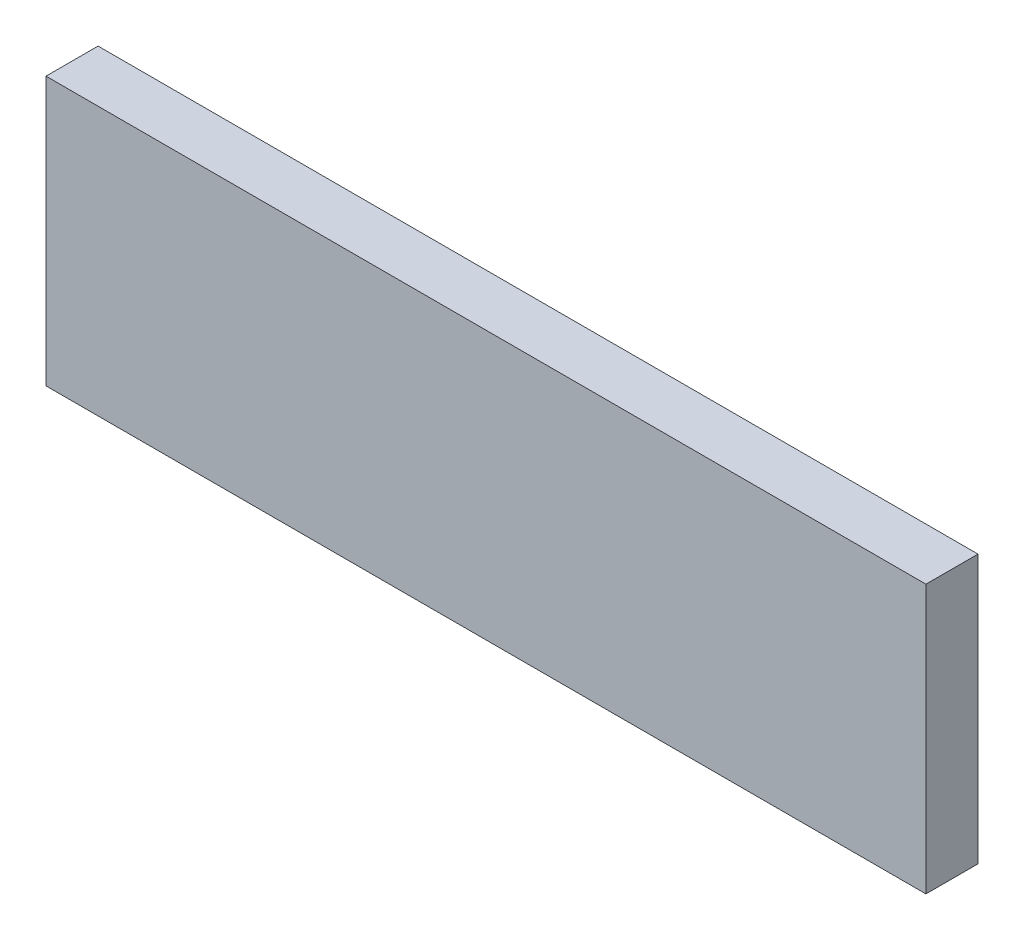
ISO-10303-21;
HEADER;
FILE_DESCRIPTION(('STEP AP214'),'2;1');
FILE_NAME('part.step','',(''),(''),'','','');
FILE_SCHEMA(('AUTOMOTIVE_DESIGN { 1 0 10303 214 1 1 1 1 }'));
ENDSEC;
DATA;
#1=APPLICATION_CONTEXT('core data for automotive mechanical design processes');
#2=APPLICATION_PROTOCOL_DEFINITION('international standard','automotive_design',2000,#1);
#3=PRODUCT_CONTEXT('',#1,'mechanical');
#4=PRODUCT('Part','Part','',(#3));
#5=PRODUCT_RELATED_PRODUCT_CATEGORY('part','',(#4));
#6=PRODUCT_DEFINITION_FORMATION('','',#4);
#7=PRODUCT_DEFINITION_CONTEXT('part definition',#1,'design');
#8=PRODUCT_DEFINITION('design','',#6,#7);
#9=PRODUCT_DEFINITION_SHAPE('','',#8);
#10=(LENGTH_UNIT() NAMED_UNIT(*) SI_UNIT(.MILLI.,.METRE.));
#11=(NAMED_UNIT(*) PLANE_ANGLE_UNIT() SI_UNIT($,.RADIAN.));
#12=(NAMED_UNIT(*) SI_UNIT($,.STERADIAN.) SOLID_ANGLE_UNIT());
#13=UNCERTAINTY_MEASURE_WITH_UNIT(LENGTH_MEASURE(1.E-05),#10,'distance_accuracy_value','');
#14=(GEOMETRIC_REPRESENTATION_CONTEXT(3) GLOBAL_UNCERTAINTY_ASSIGNED_CONTEXT((#13)) GLOBAL_UNIT_ASSIGNED_CONTEXT((#10,
#11,#12)) REPRESENTATION_CONTEXT('',''));
#15=CARTESIAN_POINT('',(0.,0.,0.));
#16=DIRECTION('',(0.,0.,1.));
#17=DIRECTION('',(1.,0.,0.));
#18=AXIS2_PLACEMENT_3D('',#15,#16,#17);
#19=CARTESIAN_POINT('',(22.3843412182742,-5.45939936918301,2.54));
#20=DIRECTION('',(-1.,0.,0.));
#21=DIRECTION('',(0.,0.,1.));
#22=AXIS2_PLACEMENT_3D('',#19,#20,#21);
#23=PLANE('',#22);
#24=DIRECTION('',(0.,1.,0.));
#25=VECTOR('',#24,1.);
#26=CARTESIAN_POINT('',(22.3843412182742,-5.45939936918301,0.));
#27=LINE('',#26,#25);
#28=CARTESIAN_POINT('',(22.3843412182742,-18.5448221959597,0.));
#29=VERTEX_POINT('',#28);
#30=CARTESIAN_POINT('',(22.3843412182742,-5.45939936918301,0.));
#31=VERTEX_POINT('',#30);
#32=EDGE_CURVE('E104',#29,#31,#27,.T.);
#33=ORIENTED_EDGE('',*,*,#32,.T.);
#34=DIRECTION('',(0.,0.,-1.));
#35=VECTOR('',#34,1.);
#36=CARTESIAN_POINT('',(22.3843412182742,-5.45939936918301,2.54));
#37=LINE('',#36,#35);
#38=CARTESIAN_POINT('',(22.3843412182742,-5.45939936918301,2.54));
#39=VERTEX_POINT('',#38);
#40=EDGE_CURVE('E11',#39,#31,#37,.T.);
#41=ORIENTED_EDGE('',*,*,#40,.F.);
#42=DIRECTION('',(0.,1.,0.));
#43=VECTOR('',#42,1.);
#44=CARTESIAN_POINT('',(22.3843412182742,-5.45939936918301,2.54));
#45=LINE('',#44,#43);
#46=CARTESIAN_POINT('',(22.3843412182742,-18.5448221959597,2.54));
#47=VERTEX_POINT('',#46);
#48=EDGE_CURVE('E92',#47,#39,#45,.T.);
#49=ORIENTED_EDGE('',*,*,#48,.F.);
#50=DIRECTION('',(0.,0.,-1.));
#51=VECTOR('',#50,1.);
#52=CARTESIAN_POINT('',(22.3843412182742,-18.5448221959597,2.54));
#53=LINE('',#52,#51);
#54=EDGE_CURVE('E100',#47,#29,#53,.T.);
#55=ORIENTED_EDGE('',*,*,#54,.T.);
#56=EDGE_LOOP('',(#33,#41,#49,#55));
#57=FACE_BOUND('',#56,.T.);
#58=ADVANCED_FACE('F41',(#57),#23,.F.);
#59=CARTESIAN_POINT('',(22.3843412182742,-5.45939936918301,2.54));
#60=DIRECTION('',(0.,-1.,0.));
#61=DIRECTION('',(0.,0.,-1.));
#62=AXIS2_PLACEMENT_3D('',#59,#60,#61);
#63=PLANE('',#62);
#64=DIRECTION('',(-1.,0.,0.));
#65=VECTOR('',#64,1.);
#66=CARTESIAN_POINT('',(22.3843412182742,-5.45939936918301,0.));
#67=LINE('',#66,#65);
#68=CARTESIAN_POINT('',(-20.5358456535535,-5.45939936918301,0.));
#69=VERTEX_POINT('',#68);
#70=EDGE_CURVE('E96',#31,#69,#67,.T.);
#71=ORIENTED_EDGE('',*,*,#70,.T.);
#72=DIRECTION('',(0.,0.,-1.));
#73=VECTOR('',#72,1.);
#74=CARTESIAN_POINT('',(-20.5358456535535,-5.45939936918301,2.54));
#75=LINE('',#74,#73);
#76=CARTESIAN_POINT('',(-20.5358456535535,-5.45939936918301,2.54));
#77=VERTEX_POINT('',#76);
#78=EDGE_CURVE('E49',#77,#69,#75,.T.);
#79=ORIENTED_EDGE('',*,*,#78,.F.);
#80=DIRECTION('',(-1.,0.,0.));
#81=VECTOR('',#80,1.);
#82=CARTESIAN_POINT('',(22.3843412182742,-5.45939936918301,2.54));
#83=LINE('',#82,#81);
#84=EDGE_CURVE('E87',#39,#77,#83,.T.);
#85=ORIENTED_EDGE('',*,*,#84,.F.);
#86=ORIENTED_EDGE('',*,*,#40,.T.);
#87=EDGE_LOOP('',(#71,#79,#85,#86));
#88=FACE_BOUND('',#87,.T.);
#89=ADVANCED_FACE('F95',(#88),#63,.F.);
#90=CARTESIAN_POINT('',(-20.5358456535535,-5.45939936918301,2.54));
#91=DIRECTION('',(1.,0.,0.));
#92=DIRECTION('',(0.,0.,-1.));
#93=AXIS2_PLACEMENT_3D('',#90,#91,#92);
#94=PLANE('',#93);
#95=DIRECTION('',(0.,-1.,0.));
#96=VECTOR('',#95,1.);
#97=CARTESIAN_POINT('',(-20.5358456535535,-5.45939936918301,0.));
#98=LINE('',#97,#96);
#99=CARTESIAN_POINT('',(-20.5358456535535,-18.5448221959597,0.));
#100=VERTEX_POINT('',#99);
#101=EDGE_CURVE('E74',#69,#100,#98,.T.);
#102=ORIENTED_EDGE('',*,*,#101,.T.);
#103=DIRECTION('',(0.,0.,-1.));
#104=VECTOR('',#103,1.);
#105=CARTESIAN_POINT('',(-20.5358456535535,-18.5448221959597,2.54));
#106=LINE('',#105,#104);
#107=CARTESIAN_POINT('',(-20.5358456535535,-18.5448221959597,2.54));
#108=VERTEX_POINT('',#107);
#109=EDGE_CURVE('E97',#108,#100,#106,.T.);
#110=ORIENTED_EDGE('',*,*,#109,.F.);
#111=DIRECTION('',(0.,-1.,0.));
#112=VECTOR('',#111,1.);
#113=CARTESIAN_POINT('',(-20.5358456535535,-5.45939936918301,2.54));
#114=LINE('',#113,#112);
#115=EDGE_CURVE('E90',#77,#108,#114,.T.);
#116=ORIENTED_EDGE('',*,*,#115,.F.);
#117=ORIENTED_EDGE('',*,*,#78,.T.);
#118=EDGE_LOOP('',(#102,#110,#116,#117));
#119=FACE_BOUND('',#118,.T.);
#120=ADVANCED_FACE('F98',(#119),#94,.F.);
#121=CARTESIAN_POINT('',(22.3843412182742,-18.5448221959597,2.54));
#122=DIRECTION('',(0.,1.,0.));
#123=DIRECTION('',(0.,0.,1.));
#124=AXIS2_PLACEMENT_3D('',#121,#122,#123);
#125=PLANE('',#124);
#126=DIRECTION('',(1.,0.,0.));
#127=VECTOR('',#126,1.);
#128=CARTESIAN_POINT('',(22.3843412182742,-18.5448221959597,0.));
#129=LINE('',#128,#127);
#130=EDGE_CURVE('E80',#100,#29,#129,.T.);
#131=ORIENTED_EDGE('',*,*,#130,.T.);
#132=ORIENTED_EDGE('',*,*,#54,.F.);
#133=DIRECTION('',(1.,0.,0.));
#134=VECTOR('',#133,1.);
#135=CARTESIAN_POINT('',(22.3843412182742,-18.5448221959597,2.54));
#136=LINE('',#135,#134);
#137=EDGE_CURVE('E57',#108,#47,#136,.T.);
#138=ORIENTED_EDGE('',*,*,#137,.F.);
#139=ORIENTED_EDGE('',*,*,#109,.T.);
#140=EDGE_LOOP('',(#131,#132,#138,#139));
#141=FACE_BOUND('',#140,.T.);
#142=ADVANCED_FACE('F111',(#141),#125,.F.);
#143=CARTESIAN_POINT('',(0.,0.,2.54));
#144=DIRECTION('',(0.,0.,-1.));
#145=DIRECTION('',(-1.,0.,0.));
#146=AXIS2_PLACEMENT_3D('',#143,#144,#145);
#147=PLANE('',#146);
#148=ORIENTED_EDGE('',*,*,#48,.T.);
#149=ORIENTED_EDGE('',*,*,#84,.T.);
#150=ORIENTED_EDGE('',*,*,#115,.T.);
#151=ORIENTED_EDGE('',*,*,#137,.T.);
#152=EDGE_LOOP('',(#148,#149,#150,#151));
#153=FACE_BOUND('',#152,.T.);
#154=ADVANCED_FACE('F88',(#153),#147,.F.);
#155=CARTESIAN_POINT('',(0.,0.,0.));
#156=DIRECTION('',(0.,0.,-1.));
#157=DIRECTION('',(-1.,0.,0.));
#158=AXIS2_PLACEMENT_3D('',#155,#156,#157);
#159=PLANE('',#158);
#160=ORIENTED_EDGE('',*,*,#32,.F.);
#161=ORIENTED_EDGE('',*,*,#130,.F.);
#162=ORIENTED_EDGE('',*,*,#101,.F.);
#163=ORIENTED_EDGE('',*,*,#70,.F.);
#164=EDGE_LOOP('',(#160,#161,#162,#163));
#165=FACE_BOUND('',#164,.T.);
#166=ADVANCED_FACE('F114',(#165),#159,.T.);
#167=CLOSED_SHELL('',(#58,#89,#120,#142,#154,#166));
#168=MANIFOLD_SOLID_BREP('B2',#167);
#169=ADVANCED_BREP_SHAPE_REPRESENTATION('',(#18,#168),#14);
#170=SHAPE_DEFINITION_REPRESENTATION(#9,#169);
ENDSEC;
END-ISO-10303-21;
